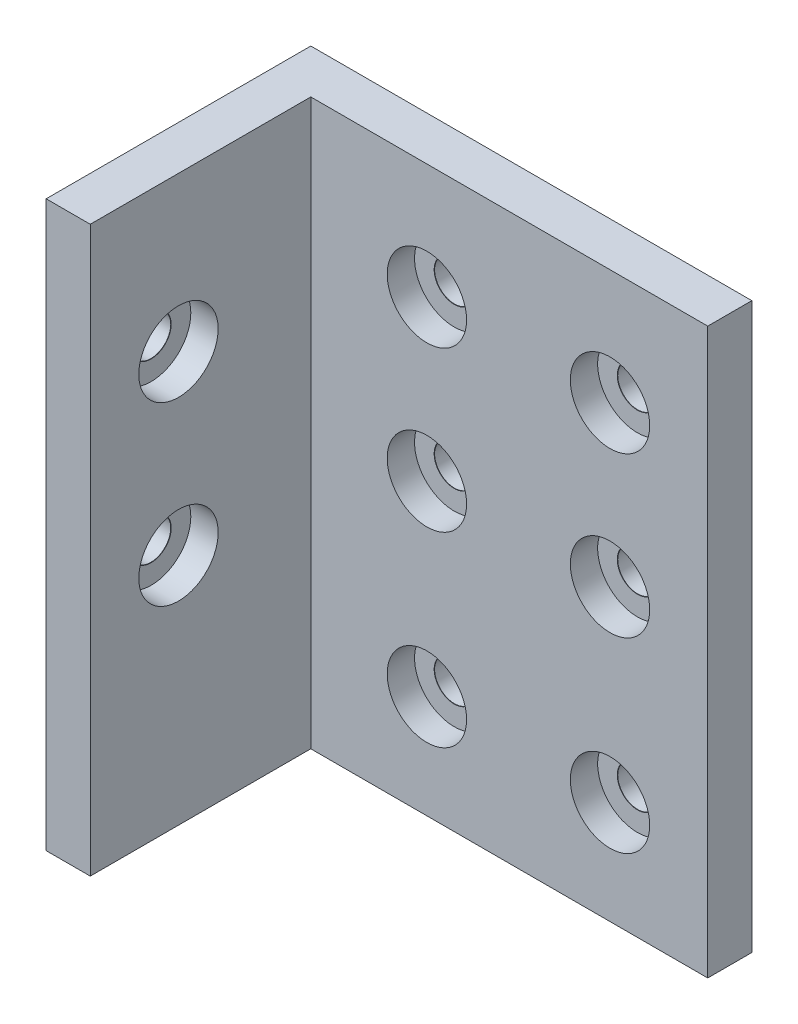
ISO-10303-21;
HEADER;
FILE_DESCRIPTION(('STEP AP214'),'2;1');
FILE_NAME('part.step','',(''),(''),'','','');
FILE_SCHEMA(('AUTOMOTIVE_DESIGN { 1 0 10303 214 1 1 1 1 }'));
ENDSEC;
DATA;
#1=APPLICATION_CONTEXT('core data for automotive mechanical design processes');
#2=APPLICATION_PROTOCOL_DEFINITION('international standard','automotive_design',2000,#1);
#3=PRODUCT_CONTEXT('',#1,'mechanical');
#4=PRODUCT('Part','Part','',(#3));
#5=PRODUCT_RELATED_PRODUCT_CATEGORY('part','',(#4));
#6=PRODUCT_DEFINITION_FORMATION('','',#4);
#7=PRODUCT_DEFINITION_CONTEXT('part definition',#1,'design');
#8=PRODUCT_DEFINITION('design','',#6,#7);
#9=PRODUCT_DEFINITION_SHAPE('','',#8);
#10=(LENGTH_UNIT() NAMED_UNIT(*) SI_UNIT(.MILLI.,.METRE.));
#11=(NAMED_UNIT(*) PLANE_ANGLE_UNIT() SI_UNIT($,.RADIAN.));
#12=(NAMED_UNIT(*) SI_UNIT($,.STERADIAN.) SOLID_ANGLE_UNIT());
#13=UNCERTAINTY_MEASURE_WITH_UNIT(LENGTH_MEASURE(1.E-05),#10,'distance_accuracy_value','');
#14=(GEOMETRIC_REPRESENTATION_CONTEXT(3) GLOBAL_UNCERTAINTY_ASSIGNED_CONTEXT((#13)) GLOBAL_UNIT_ASSIGNED_CONTEXT((#10,
#11,#12)) REPRESENTATION_CONTEXT('',''));
#15=CARTESIAN_POINT('',(0.,0.,0.));
#16=DIRECTION('',(0.,0.,1.));
#17=DIRECTION('',(1.,0.,0.));
#18=AXIS2_PLACEMENT_3D('',#15,#16,#17);
#19=CARTESIAN_POINT('',(-25.,-32.,30.));
#20=DIRECTION('',(1.,0.,0.));
#21=DIRECTION('',(0.,0.,-1.));
#22=AXIS2_PLACEMENT_3D('',#19,#20,#21);
#23=PLANE('',#22);
#24=CARTESIAN_POINT('',(-25.,-5.49999999999996,20.));
#25=DIRECTION('',(-1.,0.,0.));
#26=DIRECTION('',(0.,0.,1.));
#27=AXIS2_PLACEMENT_3D('',#24,#25,#26);
#28=CIRCLE('',#27,2.24999999999999);
#29=CARTESIAN_POINT('',(-25.,-5.49999999999996,22.25));
#30=VERTEX_POINT('',#29);
#31=EDGE_CURVE('E155',#30,#30,#28,.T.);
#32=ORIENTED_EDGE('',*,*,#31,.F.);
#33=EDGE_LOOP('',(#32));
#34=FACE_BOUND('',#33,.T.);
#35=DIRECTION('',(0.,-1.,0.));
#36=VECTOR('',#35,1.);
#37=CARTESIAN_POINT('',(-25.,-32.,0.));
#38=LINE('',#37,#36);
#39=CARTESIAN_POINT('',(-25.,32.,0.));
#40=VERTEX_POINT('',#39);
#41=CARTESIAN_POINT('',(-25.,-32.,0.));
#42=VERTEX_POINT('',#41);
#43=EDGE_CURVE('E97',#40,#42,#38,.T.);
#44=ORIENTED_EDGE('',*,*,#43,.T.);
#45=DIRECTION('',(0.,0.,-1.));
#46=VECTOR('',#45,1.);
#47=CARTESIAN_POINT('',(-25.,-32.,30.));
#48=LINE('',#47,#46);
#49=CARTESIAN_POINT('',(-25.,-32.,30.));
#50=VERTEX_POINT('',#49);
#51=EDGE_CURVE('E86',#50,#42,#48,.T.);
#52=ORIENTED_EDGE('',*,*,#51,.F.);
#53=DIRECTION('',(0.,-1.,0.));
#54=VECTOR('',#53,1.);
#55=CARTESIAN_POINT('',(-25.,-32.,30.));
#56=LINE('',#55,#54);
#57=CARTESIAN_POINT('',(-25.,32.,30.));
#58=VERTEX_POINT('',#57);
#59=EDGE_CURVE('E57',#58,#50,#56,.T.);
#60=ORIENTED_EDGE('',*,*,#59,.F.);
#61=DIRECTION('',(0.,0.,-1.));
#62=VECTOR('',#61,1.);
#63=CARTESIAN_POINT('',(-25.,32.,30.));
#64=LINE('',#63,#62);
#65=EDGE_CURVE('E111',#58,#40,#64,.T.);
#66=ORIENTED_EDGE('',*,*,#65,.T.);
#67=EDGE_LOOP('',(#44,#52,#60,#66));
#68=FACE_BOUND('',#67,.T.);
#69=CARTESIAN_POINT('',(-25.,14.5,20.));
#70=DIRECTION('',(-1.,0.,0.));
#71=DIRECTION('',(0.,0.,1.));
#72=AXIS2_PLACEMENT_3D('',#69,#70,#71);
#73=CIRCLE('',#72,2.24999999999999);
#74=CARTESIAN_POINT('',(-25.,14.5,22.25));
#75=VERTEX_POINT('',#74);
#76=EDGE_CURVE('E153',#75,#75,#73,.T.);
#77=ORIENTED_EDGE('',*,*,#76,.F.);
#78=EDGE_LOOP('',(#77));
#79=FACE_BOUND('',#78,.T.);
#80=ADVANCED_FACE('F34',(#34,#68,#79),#23,.F.);
#81=CARTESIAN_POINT('',(25.,-32.,30.));
#82=DIRECTION('',(-1.,0.,0.));
#83=DIRECTION('',(0.,0.,1.));
#84=AXIS2_PLACEMENT_3D('',#81,#82,#83);
#85=PLANE('',#84);
#86=DIRECTION('',(0.,0.,-1.));
#87=VECTOR('',#86,1.);
#88=CARTESIAN_POINT('',(25.,32.,30.));
#89=LINE('',#88,#87);
#90=CARTESIAN_POINT('',(25.,32.,5.));
#91=VERTEX_POINT('',#90);
#92=CARTESIAN_POINT('',(25.,32.,0.));
#93=VERTEX_POINT('',#92);
#94=EDGE_CURVE('E42',#91,#93,#89,.T.);
#95=ORIENTED_EDGE('',*,*,#94,.F.);
#96=DIRECTION('',(0.,-1.,0.));
#97=VECTOR('',#96,1.);
#98=CARTESIAN_POINT('',(25.,-32.,5.));
#99=LINE('',#98,#97);
#100=CARTESIAN_POINT('',(25.,-32.,5.));
#101=VERTEX_POINT('',#100);
#102=EDGE_CURVE('E83',#91,#101,#99,.T.);
#103=ORIENTED_EDGE('',*,*,#102,.T.);
#104=DIRECTION('',(0.,0.,-1.));
#105=VECTOR('',#104,1.);
#106=CARTESIAN_POINT('',(25.,-32.,30.));
#107=LINE('',#106,#105);
#108=CARTESIAN_POINT('',(25.,-32.,0.));
#109=VERTEX_POINT('',#108);
#110=EDGE_CURVE('E77',#101,#109,#107,.T.);
#111=ORIENTED_EDGE('',*,*,#110,.T.);
#112=DIRECTION('',(0.,1.,0.));
#113=VECTOR('',#112,1.);
#114=CARTESIAN_POINT('',(25.,-32.,0.));
#115=LINE('',#114,#113);
#116=EDGE_CURVE('E81',#109,#93,#115,.T.);
#117=ORIENTED_EDGE('',*,*,#116,.T.);
#118=EDGE_LOOP('',(#95,#103,#111,#117));
#119=FACE_BOUND('',#118,.T.);
#120=ADVANCED_FACE('F36',(#119),#85,.F.);
#121=CARTESIAN_POINT('',(-25.,32.,30.));
#122=DIRECTION('',(0.,-1.,0.));
#123=DIRECTION('',(0.,0.,-1.));
#124=AXIS2_PLACEMENT_3D('',#121,#122,#123);
#125=PLANE('',#124);
#126=DIRECTION('',(-1.,0.,0.));
#127=VECTOR('',#126,1.);
#128=CARTESIAN_POINT('',(-25.,32.,30.));
#129=LINE('',#128,#127);
#130=CARTESIAN_POINT('',(-20.,32.,30.));
#131=VERTEX_POINT('',#130);
#132=EDGE_CURVE('E96',#131,#58,#129,.T.);
#133=ORIENTED_EDGE('',*,*,#132,.F.);
#134=DIRECTION('',(0.,0.,1.));
#135=VECTOR('',#134,1.);
#136=CARTESIAN_POINT('',(-20.,32.,5.));
#137=LINE('',#136,#135);
#138=CARTESIAN_POINT('',(-20.,32.,5.));
#139=VERTEX_POINT('',#138);
#140=EDGE_CURVE('E49',#139,#131,#137,.T.);
#141=ORIENTED_EDGE('',*,*,#140,.F.);
#142=DIRECTION('',(-1.,0.,0.));
#143=VECTOR('',#142,1.);
#144=CARTESIAN_POINT('',(38.4438071011317,32.,5.));
#145=LINE('',#144,#143);
#146=EDGE_CURVE('E120',#91,#139,#145,.T.);
#147=ORIENTED_EDGE('',*,*,#146,.F.);
#148=ORIENTED_EDGE('',*,*,#94,.T.);
#149=DIRECTION('',(-1.,0.,0.));
#150=VECTOR('',#149,1.);
#151=CARTESIAN_POINT('',(-25.,32.,0.));
#152=LINE('',#151,#150);
#153=EDGE_CURVE('E101',#93,#40,#152,.T.);
#154=ORIENTED_EDGE('',*,*,#153,.T.);
#155=ORIENTED_EDGE('',*,*,#65,.F.);
#156=EDGE_LOOP('',(#133,#141,#147,#148,#154,#155));
#157=FACE_BOUND('',#156,.T.);
#158=ADVANCED_FACE('F116',(#157),#125,.F.);
#159=CARTESIAN_POINT('',(-25.,-32.,30.));
#160=DIRECTION('',(0.,1.,0.));
#161=DIRECTION('',(0.,0.,1.));
#162=AXIS2_PLACEMENT_3D('',#159,#160,#161);
#163=PLANE('',#162);
#164=DIRECTION('',(-1.,0.,0.));
#165=VECTOR('',#164,1.);
#166=CARTESIAN_POINT('',(38.4438071011317,-32.,5.));
#167=LINE('',#166,#165);
#168=CARTESIAN_POINT('',(-20.,-32.,5.));
#169=VERTEX_POINT('',#168);
#170=EDGE_CURVE('E131',#101,#169,#167,.T.);
#171=ORIENTED_EDGE('',*,*,#170,.T.);
#172=DIRECTION('',(0.,0.,1.));
#173=VECTOR('',#172,1.);
#174=CARTESIAN_POINT('',(-20.,-32.,5.));
#175=LINE('',#174,#173);
#176=CARTESIAN_POINT('',(-20.,-32.,30.));
#177=VERTEX_POINT('',#176);
#178=EDGE_CURVE('E135',#169,#177,#175,.T.);
#179=ORIENTED_EDGE('',*,*,#178,.T.);
#180=DIRECTION('',(1.,0.,0.));
#181=VECTOR('',#180,1.);
#182=CARTESIAN_POINT('',(-25.,-32.,30.));
#183=LINE('',#182,#181);
#184=EDGE_CURVE('E87',#50,#177,#183,.T.);
#185=ORIENTED_EDGE('',*,*,#184,.F.);
#186=ORIENTED_EDGE('',*,*,#51,.T.);
#187=DIRECTION('',(1.,0.,0.));
#188=VECTOR('',#187,1.);
#189=CARTESIAN_POINT('',(-25.,-32.,0.));
#190=LINE('',#189,#188);
#191=EDGE_CURVE('E91',#42,#109,#190,.T.);
#192=ORIENTED_EDGE('',*,*,#191,.T.);
#193=ORIENTED_EDGE('',*,*,#110,.F.);
#194=EDGE_LOOP('',(#171,#179,#185,#186,#192,#193));
#195=FACE_BOUND('',#194,.T.);
#196=ADVANCED_FACE('F92',(#195),#163,.F.);
#197=CARTESIAN_POINT('',(0.,0.,30.));
#198=DIRECTION('',(0.,0.,-1.));
#199=DIRECTION('',(-1.,0.,0.));
#200=AXIS2_PLACEMENT_3D('',#197,#198,#199);
#201=PLANE('',#200);
#202=ORIENTED_EDGE('',*,*,#184,.T.);
#203=DIRECTION('',(0.,1.,0.));
#204=VECTOR('',#203,1.);
#205=CARTESIAN_POINT('',(-20.,0.,30.));
#206=LINE('',#205,#204);
#207=EDGE_CURVE('E11',#177,#131,#206,.T.);
#208=ORIENTED_EDGE('',*,*,#207,.T.);
#209=ORIENTED_EDGE('',*,*,#132,.T.);
#210=ORIENTED_EDGE('',*,*,#59,.T.);
#211=EDGE_LOOP('',(#202,#208,#209,#210));
#212=FACE_BOUND('',#211,.T.);
#213=ADVANCED_FACE('F144',(#212),#201,.F.);
#214=CARTESIAN_POINT('',(0.,0.,0.));
#215=DIRECTION('',(0.,0.,-1.));
#216=DIRECTION('',(-1.,0.,0.));
#217=AXIS2_PLACEMENT_3D('',#214,#215,#216);
#218=PLANE('',#217);
#219=CARTESIAN_POINT('',(-6.8387302293402,18.9371519782642,0.));
#220=DIRECTION('',(0.,0.,-1.));
#221=DIRECTION('',(-1.,0.,0.));
#222=AXIS2_PLACEMENT_3D('',#219,#220,#221);
#223=CIRCLE('',#222,2.24999999999999);
#224=CARTESIAN_POINT('',(-9.08873022934019,18.9371519782642,0.));
#225=VERTEX_POINT('',#224);
#226=EDGE_CURVE('E159',#225,#225,#223,.T.);
#227=ORIENTED_EDGE('',*,*,#226,.F.);
#228=EDGE_LOOP('',(#227));
#229=FACE_BOUND('',#228,.T.);
#230=CARTESIAN_POINT('',(13.9202853801938,18.9371519782497,0.));
#231=DIRECTION('',(0.,0.,-1.));
#232=DIRECTION('',(-1.,0.,0.));
#233=AXIS2_PLACEMENT_3D('',#230,#231,#232);
#234=CIRCLE('',#233,2.24999999999999);
#235=CARTESIAN_POINT('',(11.6702853801938,18.9371519782497,0.));
#236=VERTEX_POINT('',#235);
#237=EDGE_CURVE('E168',#236,#236,#234,.T.);
#238=ORIENTED_EDGE('',*,*,#237,.F.);
#239=EDGE_LOOP('',(#238));
#240=FACE_BOUND('',#239,.T.);
#241=CARTESIAN_POINT('',(13.9202853801811,0.863082180349736,0.));
#242=DIRECTION('',(0.,0.,-1.));
#243=DIRECTION('',(-1.,0.,0.));
#244=AXIS2_PLACEMENT_3D('',#241,#242,#243);
#245=CIRCLE('',#244,2.24999999999999);
#246=CARTESIAN_POINT('',(11.6702853801811,0.863082180349736,0.));
#247=VERTEX_POINT('',#246);
#248=EDGE_CURVE('E171',#247,#247,#245,.T.);
#249=ORIENTED_EDGE('',*,*,#248,.F.);
#250=EDGE_LOOP('',(#249));
#251=FACE_BOUND('',#250,.T.);
#252=CARTESIAN_POINT('',(-6.83873022935286,0.86308218036428,0.));
#253=DIRECTION('',(0.,0.,-1.));
#254=DIRECTION('',(-1.,0.,0.));
#255=AXIS2_PLACEMENT_3D('',#252,#253,#254);
#256=CIRCLE('',#255,2.24999999999999);
#257=CARTESIAN_POINT('',(-9.08873022935285,0.86308218036428,0.));
#258=VERTEX_POINT('',#257);
#259=EDGE_CURVE('E174',#258,#258,#256,.T.);
#260=ORIENTED_EDGE('',*,*,#259,.F.);
#261=EDGE_LOOP('',(#260));
#262=FACE_BOUND('',#261,.T.);
#263=CARTESIAN_POINT('',(-6.83873022936765,-20.3015137360552,0.));
#264=DIRECTION('',(0.,0.,-1.));
#265=DIRECTION('',(-1.,0.,0.));
#266=AXIS2_PLACEMENT_3D('',#263,#264,#265);
#267=CIRCLE('',#266,2.24999999999999);
#268=CARTESIAN_POINT('',(-9.08873022936764,-20.3015137360552,0.));
#269=VERTEX_POINT('',#268);
#270=EDGE_CURVE('E177',#269,#269,#267,.T.);
#271=ORIENTED_EDGE('',*,*,#270,.F.);
#272=EDGE_LOOP('',(#271));
#273=FACE_BOUND('',#272,.T.);
#274=CARTESIAN_POINT('',(13.9202853801663,-20.3015137360697,0.));
#275=DIRECTION('',(0.,0.,-1.));
#276=DIRECTION('',(-1.,0.,0.));
#277=AXIS2_PLACEMENT_3D('',#274,#275,#276);
#278=CIRCLE('',#277,2.24999999999999);
#279=CARTESIAN_POINT('',(11.6702853801663,-20.3015137360697,0.));
#280=VERTEX_POINT('',#279);
#281=EDGE_CURVE('E142',#280,#280,#278,.T.);
#282=ORIENTED_EDGE('',*,*,#281,.F.);
#283=EDGE_LOOP('',(#282));
#284=FACE_BOUND('',#283,.T.);
#285=ORIENTED_EDGE('',*,*,#116,.F.);
#286=ORIENTED_EDGE('',*,*,#191,.F.);
#287=ORIENTED_EDGE('',*,*,#43,.F.);
#288=ORIENTED_EDGE('',*,*,#153,.F.);
#289=EDGE_LOOP('',(#285,#286,#287,#288));
#290=FACE_BOUND('',#289,.T.);
#291=ADVANCED_FACE('F100',(#229,#240,#251,#262,#273,#284,#290),#218,.T.);
#292=CARTESIAN_POINT('',(38.4438071011317,-32.,5.));
#293=DIRECTION('',(0.,0.,-1.));
#294=DIRECTION('',(-1.,0.,0.));
#295=AXIS2_PLACEMENT_3D('',#292,#293,#294);
#296=PLANE('',#295);
#297=CARTESIAN_POINT('',(13.9202853801938,18.9371519782497,5.));
#298=DIRECTION('',(0.,0.,1.));
#299=DIRECTION('',(1.,0.,0.));
#300=AXIS2_PLACEMENT_3D('',#297,#298,#299);
#301=CIRCLE('',#300,4.49999999999999);
#302=CARTESIAN_POINT('',(18.4202853801938,18.9371519782497,5.));
#303=VERTEX_POINT('',#302);
#304=EDGE_CURVE('E577',#303,#303,#301,.T.);
#305=ORIENTED_EDGE('',*,*,#304,.F.);
#306=EDGE_LOOP('',(#305));
#307=FACE_BOUND('',#306,.T.);
#308=CARTESIAN_POINT('',(-6.8387302293402,18.9371519782642,5.));
#309=DIRECTION('',(0.,0.,1.));
#310=DIRECTION('',(1.,0.,0.));
#311=AXIS2_PLACEMENT_3D('',#308,#309,#310);
#312=CIRCLE('',#311,4.49999999999999);
#313=CARTESIAN_POINT('',(-2.33873022934021,18.9371519782642,5.));
#314=VERTEX_POINT('',#313);
#315=EDGE_CURVE('E589',#314,#314,#312,.T.);
#316=ORIENTED_EDGE('',*,*,#315,.F.);
#317=EDGE_LOOP('',(#316));
#318=FACE_BOUND('',#317,.T.);
#319=CARTESIAN_POINT('',(13.9202853801811,0.863082180349736,5.));
#320=DIRECTION('',(0.,0.,1.));
#321=DIRECTION('',(1.,0.,0.));
#322=AXIS2_PLACEMENT_3D('',#319,#320,#321);
#323=CIRCLE('',#322,4.49999999999999);
#324=CARTESIAN_POINT('',(18.4202853801811,0.863082180349736,5.));
#325=VERTEX_POINT('',#324);
#326=EDGE_CURVE('E601',#325,#325,#323,.T.);
#327=ORIENTED_EDGE('',*,*,#326,.F.);
#328=EDGE_LOOP('',(#327));
#329=FACE_BOUND('',#328,.T.);
#330=CARTESIAN_POINT('',(-6.83873022935286,0.86308218036428,5.));
#331=DIRECTION('',(0.,0.,1.));
#332=DIRECTION('',(1.,0.,0.));
#333=AXIS2_PLACEMENT_3D('',#330,#331,#332);
#334=CIRCLE('',#333,4.49999999999999);
#335=CARTESIAN_POINT('',(-2.33873022935286,0.86308218036428,5.));
#336=VERTEX_POINT('',#335);
#337=EDGE_CURVE('E613',#336,#336,#334,.T.);
#338=ORIENTED_EDGE('',*,*,#337,.F.);
#339=EDGE_LOOP('',(#338));
#340=FACE_BOUND('',#339,.T.);
#341=CARTESIAN_POINT('',(13.9202853801663,-20.3015137360697,5.));
#342=DIRECTION('',(0.,0.,1.));
#343=DIRECTION('',(1.,0.,0.));
#344=AXIS2_PLACEMENT_3D('',#341,#342,#343);
#345=CIRCLE('',#344,4.49999999999999);
#346=CARTESIAN_POINT('',(18.4202853801663,-20.3015137360697,5.));
#347=VERTEX_POINT('',#346);
#348=EDGE_CURVE('E625',#347,#347,#345,.T.);
#349=ORIENTED_EDGE('',*,*,#348,.F.);
#350=EDGE_LOOP('',(#349));
#351=FACE_BOUND('',#350,.T.);
#352=CARTESIAN_POINT('',(-6.83873022936765,-20.3015137360552,5.));
#353=DIRECTION('',(0.,0.,1.));
#354=DIRECTION('',(1.,0.,0.));
#355=AXIS2_PLACEMENT_3D('',#352,#353,#354);
#356=CIRCLE('',#355,4.49999999999999);
#357=CARTESIAN_POINT('',(-2.33873022936766,-20.3015137360552,5.));
#358=VERTEX_POINT('',#357);
#359=EDGE_CURVE('E637',#358,#358,#356,.T.);
#360=ORIENTED_EDGE('',*,*,#359,.F.);
#361=EDGE_LOOP('',(#360));
#362=FACE_BOUND('',#361,.T.);
#363=ORIENTED_EDGE('',*,*,#146,.T.);
#364=DIRECTION('',(0.,1.,0.));
#365=VECTOR('',#364,1.);
#366=CARTESIAN_POINT('',(-20.,-32.,5.));
#367=LINE('',#366,#365);
#368=EDGE_CURVE('E104',#169,#139,#367,.T.);
#369=ORIENTED_EDGE('',*,*,#368,.F.);
#370=ORIENTED_EDGE('',*,*,#170,.F.);
#371=ORIENTED_EDGE('',*,*,#102,.F.);
#372=EDGE_LOOP('',(#363,#369,#370,#371));
#373=FACE_BOUND('',#372,.T.);
#374=ADVANCED_FACE('F132',(#307,#318,#329,#340,#351,#362,#373),#296,.F.);
#375=CARTESIAN_POINT('',(-20.,-32.,5.));
#376=DIRECTION('',(-1.,0.,0.));
#377=DIRECTION('',(0.,0.,1.));
#378=AXIS2_PLACEMENT_3D('',#375,#376,#377);
#379=PLANE('',#378);
#380=CARTESIAN_POINT('',(-20.,14.5,20.));
#381=DIRECTION('',(1.,0.,0.));
#382=DIRECTION('',(0.,0.,-1.));
#383=AXIS2_PLACEMENT_3D('',#380,#381,#382);
#384=CIRCLE('',#383,4.5);
#385=CARTESIAN_POINT('',(-20.,14.5,15.5));
#386=VERTEX_POINT('',#385);
#387=EDGE_CURVE('E555',#386,#386,#384,.T.);
#388=ORIENTED_EDGE('',*,*,#387,.F.);
#389=EDGE_LOOP('',(#388));
#390=FACE_BOUND('',#389,.T.);
#391=CARTESIAN_POINT('',(-20.,-5.49999999999996,20.));
#392=DIRECTION('',(1.,0.,0.));
#393=DIRECTION('',(0.,0.,-1.));
#394=AXIS2_PLACEMENT_3D('',#391,#392,#393);
#395=CIRCLE('',#394,4.49999999999999);
#396=CARTESIAN_POINT('',(-20.,-5.49999999999996,15.5));
#397=VERTEX_POINT('',#396);
#398=EDGE_CURVE('E565',#397,#397,#395,.T.);
#399=ORIENTED_EDGE('',*,*,#398,.F.);
#400=EDGE_LOOP('',(#399));
#401=FACE_BOUND('',#400,.T.);
#402=ORIENTED_EDGE('',*,*,#178,.F.);
#403=ORIENTED_EDGE('',*,*,#368,.T.);
#404=ORIENTED_EDGE('',*,*,#140,.T.);
#405=ORIENTED_EDGE('',*,*,#207,.F.);
#406=EDGE_LOOP('',(#402,#403,#404,#405));
#407=FACE_BOUND('',#406,.T.);
#408=ADVANCED_FACE('F145',(#390,#401,#407),#379,.F.);
#409=CARTESIAN_POINT('',(13.9202853801663,-20.3015137360697,0.));
#410=DIRECTION('',(0.,0.,-1.));
#411=DIRECTION('',(-1.,0.,0.));
#412=AXIS2_PLACEMENT_3D('',#409,#410,#411);
#413=CYLINDRICAL_SURFACE('',#412,2.24999999999999);
#414=CARTESIAN_POINT('',(13.9202853801663,-20.3015137360697,1.875));
#415=DIRECTION('',(0.,0.,1.));
#416=DIRECTION('',(1.,0.,0.));
#417=AXIS2_PLACEMENT_3D('',#414,#415,#416);
#418=CIRCLE('',#417,2.25);
#419=CARTESIAN_POINT('',(16.1702853801663,-20.3015137360697,1.875));
#420=VERTEX_POINT('',#419);
#421=EDGE_CURVE('E634',#420,#420,#418,.T.);
#422=ORIENTED_EDGE('',*,*,#421,.T.);
#423=EDGE_LOOP('',(#422));
#424=FACE_BOUND('',#423,.T.);
#425=ORIENTED_EDGE('',*,*,#281,.T.);
#426=EDGE_LOOP('',(#425));
#427=FACE_BOUND('',#426,.T.);
#428=ADVANCED_FACE('F182',(#424,#427),#413,.F.);
#429=CARTESIAN_POINT('',(-6.83873022936765,-20.3015137360552,0.));
#430=DIRECTION('',(0.,0.,-1.));
#431=DIRECTION('',(-1.,0.,0.));
#432=AXIS2_PLACEMENT_3D('',#429,#430,#431);
#433=CYLINDRICAL_SURFACE('',#432,2.24999999999999);
#434=CARTESIAN_POINT('',(-6.83873022936765,-20.3015137360552,1.875));
#435=DIRECTION('',(0.,0.,1.));
#436=DIRECTION('',(1.,0.,0.));
#437=AXIS2_PLACEMENT_3D('',#434,#435,#436);
#438=CIRCLE('',#437,2.25);
#439=CARTESIAN_POINT('',(-4.58873022936765,-20.3015137360552,1.875));
#440=VERTEX_POINT('',#439);
#441=EDGE_CURVE('E156',#440,#440,#438,.T.);
#442=ORIENTED_EDGE('',*,*,#441,.T.);
#443=EDGE_LOOP('',(#442));
#444=FACE_BOUND('',#443,.T.);
#445=ORIENTED_EDGE('',*,*,#270,.T.);
#446=EDGE_LOOP('',(#445));
#447=FACE_BOUND('',#446,.T.);
#448=ADVANCED_FACE('F231',(#444,#447),#433,.F.);
#449=CARTESIAN_POINT('',(-6.83873022935286,0.86308218036428,0.));
#450=DIRECTION('',(0.,0.,-1.));
#451=DIRECTION('',(-1.,0.,0.));
#452=AXIS2_PLACEMENT_3D('',#449,#450,#451);
#453=CYLINDRICAL_SURFACE('',#452,2.24999999999999);
#454=CARTESIAN_POINT('',(-6.83873022935286,0.86308218036428,1.875));
#455=DIRECTION('',(0.,0.,1.));
#456=DIRECTION('',(1.,0.,0.));
#457=AXIS2_PLACEMENT_3D('',#454,#455,#456);
#458=CIRCLE('',#457,2.25);
#459=CARTESIAN_POINT('',(-4.58873022935286,0.86308218036428,1.875));
#460=VERTEX_POINT('',#459);
#461=EDGE_CURVE('E622',#460,#460,#458,.T.);
#462=ORIENTED_EDGE('',*,*,#461,.T.);
#463=EDGE_LOOP('',(#462));
#464=FACE_BOUND('',#463,.T.);
#465=ORIENTED_EDGE('',*,*,#259,.T.);
#466=EDGE_LOOP('',(#465));
#467=FACE_BOUND('',#466,.T.);
#468=ADVANCED_FACE('F241',(#464,#467),#453,.F.);
#469=CARTESIAN_POINT('',(13.9202853801811,0.863082180349736,0.));
#470=DIRECTION('',(0.,0.,-1.));
#471=DIRECTION('',(-1.,0.,0.));
#472=AXIS2_PLACEMENT_3D('',#469,#470,#471);
#473=CYLINDRICAL_SURFACE('',#472,2.24999999999999);
#474=CARTESIAN_POINT('',(13.9202853801811,0.863082180349736,1.875));
#475=DIRECTION('',(0.,0.,1.));
#476=DIRECTION('',(1.,0.,0.));
#477=AXIS2_PLACEMENT_3D('',#474,#475,#476);
#478=CIRCLE('',#477,2.25);
#479=CARTESIAN_POINT('',(16.1702853801811,0.863082180349736,1.875));
#480=VERTEX_POINT('',#479);
#481=EDGE_CURVE('E610',#480,#480,#478,.T.);
#482=ORIENTED_EDGE('',*,*,#481,.T.);
#483=EDGE_LOOP('',(#482));
#484=FACE_BOUND('',#483,.T.);
#485=ORIENTED_EDGE('',*,*,#248,.T.);
#486=EDGE_LOOP('',(#485));
#487=FACE_BOUND('',#486,.T.);
#488=ADVANCED_FACE('F251',(#484,#487),#473,.F.);
#489=CARTESIAN_POINT('',(13.9202853801938,18.9371519782497,0.));
#490=DIRECTION('',(0.,0.,-1.));
#491=DIRECTION('',(-1.,0.,0.));
#492=AXIS2_PLACEMENT_3D('',#489,#490,#491);
#493=CYLINDRICAL_SURFACE('',#492,2.24999999999999);
#494=CARTESIAN_POINT('',(13.9202853801938,18.9371519782497,1.875));
#495=DIRECTION('',(0.,0.,1.));
#496=DIRECTION('',(1.,0.,0.));
#497=AXIS2_PLACEMENT_3D('',#494,#495,#496);
#498=CIRCLE('',#497,2.25);
#499=CARTESIAN_POINT('',(16.1702853801938,18.9371519782497,1.875));
#500=VERTEX_POINT('',#499);
#501=EDGE_CURVE('E586',#500,#500,#498,.T.);
#502=ORIENTED_EDGE('',*,*,#501,.T.);
#503=EDGE_LOOP('',(#502));
#504=FACE_BOUND('',#503,.T.);
#505=ORIENTED_EDGE('',*,*,#237,.T.);
#506=EDGE_LOOP('',(#505));
#507=FACE_BOUND('',#506,.T.);
#508=ADVANCED_FACE('F261',(#504,#507),#493,.F.);
#509=CARTESIAN_POINT('',(-6.8387302293402,18.9371519782642,0.));
#510=DIRECTION('',(0.,0.,-1.));
#511=DIRECTION('',(-1.,0.,0.));
#512=AXIS2_PLACEMENT_3D('',#509,#510,#511);
#513=CYLINDRICAL_SURFACE('',#512,2.24999999999999);
#514=CARTESIAN_POINT('',(-6.8387302293402,18.9371519782642,1.875));
#515=DIRECTION('',(0.,0.,1.));
#516=DIRECTION('',(1.,0.,0.));
#517=AXIS2_PLACEMENT_3D('',#514,#515,#516);
#518=CIRCLE('',#517,2.25);
#519=CARTESIAN_POINT('',(-4.5887302293402,18.9371519782642,1.875));
#520=VERTEX_POINT('',#519);
#521=EDGE_CURVE('E598',#520,#520,#518,.T.);
#522=ORIENTED_EDGE('',*,*,#521,.T.);
#523=EDGE_LOOP('',(#522));
#524=FACE_BOUND('',#523,.T.);
#525=ORIENTED_EDGE('',*,*,#226,.T.);
#526=EDGE_LOOP('',(#525));
#527=FACE_BOUND('',#526,.T.);
#528=ADVANCED_FACE('F271',(#524,#527),#513,.F.);
#529=CARTESIAN_POINT('',(-25.,-5.49999999999996,20.));
#530=DIRECTION('',(-1.,0.,0.));
#531=DIRECTION('',(0.,0.,1.));
#532=AXIS2_PLACEMENT_3D('',#529,#530,#531);
#533=CYLINDRICAL_SURFACE('',#532,2.24999999999999);
#534=CARTESIAN_POINT('',(-23.125,-5.49999999999996,20.));
#535=DIRECTION('',(1.,0.,0.));
#536=DIRECTION('',(0.,0.,-1.));
#537=AXIS2_PLACEMENT_3D('',#534,#535,#536);
#538=CIRCLE('',#537,2.25);
#539=CARTESIAN_POINT('',(-23.125,-5.49999999999996,17.75));
#540=VERTEX_POINT('',#539);
#541=EDGE_CURVE('E574',#540,#540,#538,.T.);
#542=ORIENTED_EDGE('',*,*,#541,.T.);
#543=EDGE_LOOP('',(#542));
#544=FACE_BOUND('',#543,.T.);
#545=ORIENTED_EDGE('',*,*,#31,.T.);
#546=EDGE_LOOP('',(#545));
#547=FACE_BOUND('',#546,.T.);
#548=ADVANCED_FACE('F280',(#544,#547),#533,.F.);
#549=CARTESIAN_POINT('',(-25.,14.5,20.));
#550=DIRECTION('',(-1.,0.,0.));
#551=DIRECTION('',(0.,0.,1.));
#552=AXIS2_PLACEMENT_3D('',#549,#550,#551);
#553=CYLINDRICAL_SURFACE('',#552,2.24999999999999);
#554=CARTESIAN_POINT('',(-23.125,14.5,20.));
#555=DIRECTION('',(1.,0.,0.));
#556=DIRECTION('',(0.,0.,-1.));
#557=AXIS2_PLACEMENT_3D('',#554,#555,#556);
#558=CIRCLE('',#557,2.25);
#559=CARTESIAN_POINT('',(-23.125,14.5,17.75));
#560=VERTEX_POINT('',#559);
#561=EDGE_CURVE('E562',#560,#560,#558,.T.);
#562=ORIENTED_EDGE('',*,*,#561,.T.);
#563=EDGE_LOOP('',(#562));
#564=FACE_BOUND('',#563,.T.);
#565=ORIENTED_EDGE('',*,*,#76,.T.);
#566=EDGE_LOOP('',(#565));
#567=FACE_BOUND('',#566,.T.);
#568=ADVANCED_FACE('F293',(#564,#567),#553,.F.);
#569=CARTESIAN_POINT('',(-6.83873022936765,-20.3015137360552,1.9));
#570=DIRECTION('',(0.,0.,1.));
#571=DIRECTION('',(1.,0.,0.));
#572=AXIS2_PLACEMENT_3D('',#569,#570,#571);
#573=CONICAL_SURFACE('',#572,2.275,0.785398163397483);
#574=ORIENTED_EDGE('',*,*,#441,.F.);
#575=EDGE_LOOP('',(#574));
#576=FACE_BOUND('',#575,.T.);
#577=CARTESIAN_POINT('',(-6.83873022936765,-20.3015137360552,1.9));
#578=DIRECTION('',(0.,0.,1.));
#579=DIRECTION('',(1.,0.,0.));
#580=AXIS2_PLACEMENT_3D('',#577,#578,#579);
#581=CIRCLE('',#580,2.275);
#582=CARTESIAN_POINT('',(-4.56373022936765,-20.3015137360552,1.9));
#583=VERTEX_POINT('',#582);
#584=EDGE_CURVE('E162',#583,#583,#581,.T.);
#585=ORIENTED_EDGE('',*,*,#584,.T.);
#586=EDGE_LOOP('',(#585));
#587=FACE_BOUND('',#586,.T.);
#588=ADVANCED_FACE('F287',(#576,#587),#573,.F.);
#589=CARTESIAN_POINT('',(-4.56373022936765,-20.3015137360552,1.9));
#590=DIRECTION('',(0.,0.,-1.));
#591=DIRECTION('',(-1.,0.,0.));
#592=AXIS2_PLACEMENT_3D('',#589,#590,#591);
#593=PLANE('',#592);
#594=ORIENTED_EDGE('',*,*,#584,.F.);
#595=EDGE_LOOP('',(#594));
#596=FACE_BOUND('',#595,.T.);
#597=CARTESIAN_POINT('',(-6.83873022936765,-20.3015137360552,1.9));
#598=DIRECTION('',(0.,0.,1.));
#599=DIRECTION('',(1.,0.,0.));
#600=AXIS2_PLACEMENT_3D('',#597,#598,#599);
#601=CIRCLE('',#600,4.49999999999999);
#602=CARTESIAN_POINT('',(-2.33873022936766,-20.3015137360552,1.9));
#603=VERTEX_POINT('',#602);
#604=EDGE_CURVE('E640',#603,#603,#601,.T.);
#605=ORIENTED_EDGE('',*,*,#604,.T.);
#606=EDGE_LOOP('',(#605));
#607=FACE_BOUND('',#606,.T.);
#608=ADVANCED_FACE('F292',(#596,#607),#593,.F.);
#609=CARTESIAN_POINT('',(-6.83873022936765,-20.3015137360552,5.));
#610=DIRECTION('',(0.,0.,1.));
#611=DIRECTION('',(1.,0.,0.));
#612=AXIS2_PLACEMENT_3D('',#609,#610,#611);
#613=CYLINDRICAL_SURFACE('',#612,4.49999999999999);
#614=ORIENTED_EDGE('',*,*,#604,.F.);
#615=EDGE_LOOP('',(#614));
#616=FACE_BOUND('',#615,.T.);
#617=ORIENTED_EDGE('',*,*,#359,.T.);
#618=EDGE_LOOP('',(#617));
#619=FACE_BOUND('',#618,.T.);
#620=ADVANCED_FACE('F305',(#616,#619),#613,.F.);
#621=CARTESIAN_POINT('',(13.9202853801663,-20.3015137360697,1.9));
#622=DIRECTION('',(0.,0.,1.));
#623=DIRECTION('',(1.,0.,0.));
#624=AXIS2_PLACEMENT_3D('',#621,#622,#623);
#625=CONICAL_SURFACE('',#624,2.275,0.785398163397448);
#626=ORIENTED_EDGE('',*,*,#421,.F.);
#627=EDGE_LOOP('',(#626));
#628=FACE_BOUND('',#627,.T.);
#629=CARTESIAN_POINT('',(13.9202853801663,-20.3015137360697,1.9));
#630=DIRECTION('',(0.,0.,1.));
#631=DIRECTION('',(1.,0.,0.));
#632=AXIS2_PLACEMENT_3D('',#629,#630,#631);
#633=CIRCLE('',#632,2.275);
#634=CARTESIAN_POINT('',(16.1952853801663,-20.3015137360697,1.9));
#635=VERTEX_POINT('',#634);
#636=EDGE_CURVE('E631',#635,#635,#633,.T.);
#637=ORIENTED_EDGE('',*,*,#636,.T.);
#638=EDGE_LOOP('',(#637));
#639=FACE_BOUND('',#638,.T.);
#640=ADVANCED_FACE('F315',(#628,#639),#625,.F.);
#641=CARTESIAN_POINT('',(16.1952853801663,-20.3015137360697,1.9));
#642=DIRECTION('',(0.,0.,-1.));
#643=DIRECTION('',(-1.,0.,0.));
#644=AXIS2_PLACEMENT_3D('',#641,#642,#643);
#645=PLANE('',#644);
#646=ORIENTED_EDGE('',*,*,#636,.F.);
#647=EDGE_LOOP('',(#646));
#648=FACE_BOUND('',#647,.T.);
#649=CARTESIAN_POINT('',(13.9202853801663,-20.3015137360697,1.9));
#650=DIRECTION('',(0.,0.,1.));
#651=DIRECTION('',(1.,0.,0.));
#652=AXIS2_PLACEMENT_3D('',#649,#650,#651);
#653=CIRCLE('',#652,4.49999999999999);
#654=CARTESIAN_POINT('',(18.4202853801663,-20.3015137360697,1.9));
#655=VERTEX_POINT('',#654);
#656=EDGE_CURVE('E628',#655,#655,#653,.T.);
#657=ORIENTED_EDGE('',*,*,#656,.T.);
#658=EDGE_LOOP('',(#657));
#659=FACE_BOUND('',#658,.T.);
#660=ADVANCED_FACE('F325',(#648,#659),#645,.F.);
#661=CARTESIAN_POINT('',(13.9202853801663,-20.3015137360697,5.));
#662=DIRECTION('',(0.,0.,1.));
#663=DIRECTION('',(1.,0.,0.));
#664=AXIS2_PLACEMENT_3D('',#661,#662,#663);
#665=CYLINDRICAL_SURFACE('',#664,4.49999999999999);
#666=ORIENTED_EDGE('',*,*,#656,.F.);
#667=EDGE_LOOP('',(#666));
#668=FACE_BOUND('',#667,.T.);
#669=ORIENTED_EDGE('',*,*,#348,.T.);
#670=EDGE_LOOP('',(#669));
#671=FACE_BOUND('',#670,.T.);
#672=ADVANCED_FACE('F335',(#668,#671),#665,.F.);
#673=CARTESIAN_POINT('',(-6.83873022935286,0.86308218036428,1.9));
#674=DIRECTION('',(0.,0.,1.));
#675=DIRECTION('',(1.,0.,0.));
#676=AXIS2_PLACEMENT_3D('',#673,#674,#675);
#677=CONICAL_SURFACE('',#676,2.275,0.785398163397483);
#678=ORIENTED_EDGE('',*,*,#461,.F.);
#679=EDGE_LOOP('',(#678));
#680=FACE_BOUND('',#679,.T.);
#681=CARTESIAN_POINT('',(-6.83873022935286,0.86308218036428,1.9));
#682=DIRECTION('',(0.,0.,1.));
#683=DIRECTION('',(1.,0.,0.));
#684=AXIS2_PLACEMENT_3D('',#681,#682,#683);
#685=CIRCLE('',#684,2.275);
#686=CARTESIAN_POINT('',(-4.56373022935286,0.86308218036428,1.9));
#687=VERTEX_POINT('',#686);
#688=EDGE_CURVE('E619',#687,#687,#685,.T.);
#689=ORIENTED_EDGE('',*,*,#688,.T.);
#690=EDGE_LOOP('',(#689));
#691=FACE_BOUND('',#690,.T.);
#692=ADVANCED_FACE('F345',(#680,#691),#677,.F.);
#693=CARTESIAN_POINT('',(-4.56373022935286,0.86308218036428,1.9));
#694=DIRECTION('',(0.,0.,-1.));
#695=DIRECTION('',(-1.,0.,0.));
#696=AXIS2_PLACEMENT_3D('',#693,#694,#695);
#697=PLANE('',#696);
#698=ORIENTED_EDGE('',*,*,#688,.F.);
#699=EDGE_LOOP('',(#698));
#700=FACE_BOUND('',#699,.T.);
#701=CARTESIAN_POINT('',(-6.83873022935286,0.86308218036428,1.9));
#702=DIRECTION('',(0.,0.,1.));
#703=DIRECTION('',(1.,0.,0.));
#704=AXIS2_PLACEMENT_3D('',#701,#702,#703);
#705=CIRCLE('',#704,4.49999999999999);
#706=CARTESIAN_POINT('',(-2.33873022935286,0.86308218036428,1.9));
#707=VERTEX_POINT('',#706);
#708=EDGE_CURVE('E616',#707,#707,#705,.T.);
#709=ORIENTED_EDGE('',*,*,#708,.T.);
#710=EDGE_LOOP('',(#709));
#711=FACE_BOUND('',#710,.T.);
#712=ADVANCED_FACE('F355',(#700,#711),#697,.F.);
#713=CARTESIAN_POINT('',(-6.83873022935286,0.86308218036428,5.));
#714=DIRECTION('',(0.,0.,1.));
#715=DIRECTION('',(1.,0.,0.));
#716=AXIS2_PLACEMENT_3D('',#713,#714,#715);
#717=CYLINDRICAL_SURFACE('',#716,4.49999999999999);
#718=ORIENTED_EDGE('',*,*,#708,.F.);
#719=EDGE_LOOP('',(#718));
#720=FACE_BOUND('',#719,.T.);
#721=ORIENTED_EDGE('',*,*,#337,.T.);
#722=EDGE_LOOP('',(#721));
#723=FACE_BOUND('',#722,.T.);
#724=ADVANCED_FACE('F365',(#720,#723),#717,.F.);
#725=CARTESIAN_POINT('',(13.9202853801811,0.863082180349736,1.9));
#726=DIRECTION('',(0.,0.,1.));
#727=DIRECTION('',(1.,0.,0.));
#728=AXIS2_PLACEMENT_3D('',#725,#726,#727);
#729=CONICAL_SURFACE('',#728,2.275,0.785398163397448);
#730=ORIENTED_EDGE('',*,*,#481,.F.);
#731=EDGE_LOOP('',(#730));
#732=FACE_BOUND('',#731,.T.);
#733=CARTESIAN_POINT('',(13.9202853801811,0.863082180349736,1.9));
#734=DIRECTION('',(0.,0.,1.));
#735=DIRECTION('',(1.,0.,0.));
#736=AXIS2_PLACEMENT_3D('',#733,#734,#735);
#737=CIRCLE('',#736,2.275);
#738=CARTESIAN_POINT('',(16.1952853801811,0.863082180349736,1.9));
#739=VERTEX_POINT('',#738);
#740=EDGE_CURVE('E607',#739,#739,#737,.T.);
#741=ORIENTED_EDGE('',*,*,#740,.T.);
#742=EDGE_LOOP('',(#741));
#743=FACE_BOUND('',#742,.T.);
#744=ADVANCED_FACE('F375',(#732,#743),#729,.F.);
#745=CARTESIAN_POINT('',(16.1952853801811,0.863082180349736,1.9));
#746=DIRECTION('',(0.,0.,-1.));
#747=DIRECTION('',(-1.,0.,0.));
#748=AXIS2_PLACEMENT_3D('',#745,#746,#747);
#749=PLANE('',#748);
#750=ORIENTED_EDGE('',*,*,#740,.F.);
#751=EDGE_LOOP('',(#750));
#752=FACE_BOUND('',#751,.T.);
#753=CARTESIAN_POINT('',(13.9202853801811,0.863082180349736,1.9));
#754=DIRECTION('',(0.,0.,1.));
#755=DIRECTION('',(1.,0.,0.));
#756=AXIS2_PLACEMENT_3D('',#753,#754,#755);
#757=CIRCLE('',#756,4.49999999999999);
#758=CARTESIAN_POINT('',(18.4202853801811,0.863082180349736,1.9));
#759=VERTEX_POINT('',#758);
#760=EDGE_CURVE('E604',#759,#759,#757,.T.);
#761=ORIENTED_EDGE('',*,*,#760,.T.);
#762=EDGE_LOOP('',(#761));
#763=FACE_BOUND('',#762,.T.);
#764=ADVANCED_FACE('F385',(#752,#763),#749,.F.);
#765=CARTESIAN_POINT('',(13.9202853801811,0.863082180349736,5.));
#766=DIRECTION('',(0.,0.,1.));
#767=DIRECTION('',(1.,0.,0.));
#768=AXIS2_PLACEMENT_3D('',#765,#766,#767);
#769=CYLINDRICAL_SURFACE('',#768,4.49999999999999);
#770=ORIENTED_EDGE('',*,*,#760,.F.);
#771=EDGE_LOOP('',(#770));
#772=FACE_BOUND('',#771,.T.);
#773=ORIENTED_EDGE('',*,*,#326,.T.);
#774=EDGE_LOOP('',(#773));
#775=FACE_BOUND('',#774,.T.);
#776=ADVANCED_FACE('F395',(#772,#775),#769,.F.);
#777=CARTESIAN_POINT('',(-6.8387302293402,18.9371519782642,1.9));
#778=DIRECTION('',(0.,0.,1.));
#779=DIRECTION('',(1.,0.,0.));
#780=AXIS2_PLACEMENT_3D('',#777,#778,#779);
#781=CONICAL_SURFACE('',#780,2.275,0.785398163397483);
#782=ORIENTED_EDGE('',*,*,#521,.F.);
#783=EDGE_LOOP('',(#782));
#784=FACE_BOUND('',#783,.T.);
#785=CARTESIAN_POINT('',(-6.8387302293402,18.9371519782642,1.9));
#786=DIRECTION('',(0.,0.,1.));
#787=DIRECTION('',(1.,0.,0.));
#788=AXIS2_PLACEMENT_3D('',#785,#786,#787);
#789=CIRCLE('',#788,2.275);
#790=CARTESIAN_POINT('',(-4.5637302293402,18.9371519782642,1.9));
#791=VERTEX_POINT('',#790);
#792=EDGE_CURVE('E595',#791,#791,#789,.T.);
#793=ORIENTED_EDGE('',*,*,#792,.T.);
#794=EDGE_LOOP('',(#793));
#795=FACE_BOUND('',#794,.T.);
#796=ADVANCED_FACE('F405',(#784,#795),#781,.F.);
#797=CARTESIAN_POINT('',(-4.5637302293402,18.9371519782642,1.9));
#798=DIRECTION('',(0.,0.,-1.));
#799=DIRECTION('',(-1.,0.,0.));
#800=AXIS2_PLACEMENT_3D('',#797,#798,#799);
#801=PLANE('',#800);
#802=ORIENTED_EDGE('',*,*,#792,.F.);
#803=EDGE_LOOP('',(#802));
#804=FACE_BOUND('',#803,.T.);
#805=CARTESIAN_POINT('',(-6.8387302293402,18.9371519782642,1.9));
#806=DIRECTION('',(0.,0.,1.));
#807=DIRECTION('',(1.,0.,0.));
#808=AXIS2_PLACEMENT_3D('',#805,#806,#807);
#809=CIRCLE('',#808,4.49999999999999);
#810=CARTESIAN_POINT('',(-2.33873022934021,18.9371519782642,1.9));
#811=VERTEX_POINT('',#810);
#812=EDGE_CURVE('E592',#811,#811,#809,.T.);
#813=ORIENTED_EDGE('',*,*,#812,.T.);
#814=EDGE_LOOP('',(#813));
#815=FACE_BOUND('',#814,.T.);
#816=ADVANCED_FACE('F415',(#804,#815),#801,.F.);
#817=CARTESIAN_POINT('',(-6.8387302293402,18.9371519782642,5.));
#818=DIRECTION('',(0.,0.,1.));
#819=DIRECTION('',(1.,0.,0.));
#820=AXIS2_PLACEMENT_3D('',#817,#818,#819);
#821=CYLINDRICAL_SURFACE('',#820,4.49999999999999);
#822=ORIENTED_EDGE('',*,*,#812,.F.);
#823=EDGE_LOOP('',(#822));
#824=FACE_BOUND('',#823,.T.);
#825=ORIENTED_EDGE('',*,*,#315,.T.);
#826=EDGE_LOOP('',(#825));
#827=FACE_BOUND('',#826,.T.);
#828=ADVANCED_FACE('F425',(#824,#827),#821,.F.);
#829=CARTESIAN_POINT('',(13.9202853801938,18.9371519782497,1.9));
#830=DIRECTION('',(0.,0.,1.));
#831=DIRECTION('',(1.,0.,0.));
#832=AXIS2_PLACEMENT_3D('',#829,#830,#831);
#833=CONICAL_SURFACE('',#832,2.275,0.785398163397448);
#834=ORIENTED_EDGE('',*,*,#501,.F.);
#835=EDGE_LOOP('',(#834));
#836=FACE_BOUND('',#835,.T.);
#837=CARTESIAN_POINT('',(13.9202853801938,18.9371519782497,1.9));
#838=DIRECTION('',(0.,0.,1.));
#839=DIRECTION('',(1.,0.,0.));
#840=AXIS2_PLACEMENT_3D('',#837,#838,#839);
#841=CIRCLE('',#840,2.275);
#842=CARTESIAN_POINT('',(16.1952853801938,18.9371519782497,1.9));
#843=VERTEX_POINT('',#842);
#844=EDGE_CURVE('E583',#843,#843,#841,.T.);
#845=ORIENTED_EDGE('',*,*,#844,.T.);
#846=EDGE_LOOP('',(#845));
#847=FACE_BOUND('',#846,.T.);
#848=ADVANCED_FACE('F435',(#836,#847),#833,.F.);
#849=CARTESIAN_POINT('',(16.1952853801938,18.9371519782497,1.9));
#850=DIRECTION('',(0.,0.,-1.));
#851=DIRECTION('',(-1.,0.,0.));
#852=AXIS2_PLACEMENT_3D('',#849,#850,#851);
#853=PLANE('',#852);
#854=ORIENTED_EDGE('',*,*,#844,.F.);
#855=EDGE_LOOP('',(#854));
#856=FACE_BOUND('',#855,.T.);
#857=CARTESIAN_POINT('',(13.9202853801938,18.9371519782497,1.9));
#858=DIRECTION('',(0.,0.,1.));
#859=DIRECTION('',(1.,0.,0.));
#860=AXIS2_PLACEMENT_3D('',#857,#858,#859);
#861=CIRCLE('',#860,4.49999999999999);
#862=CARTESIAN_POINT('',(18.4202853801938,18.9371519782497,1.9));
#863=VERTEX_POINT('',#862);
#864=EDGE_CURVE('E580',#863,#863,#861,.T.);
#865=ORIENTED_EDGE('',*,*,#864,.T.);
#866=EDGE_LOOP('',(#865));
#867=FACE_BOUND('',#866,.T.);
#868=ADVANCED_FACE('F445',(#856,#867),#853,.F.);
#869=CARTESIAN_POINT('',(13.9202853801938,18.9371519782497,5.));
#870=DIRECTION('',(0.,0.,1.));
#871=DIRECTION('',(1.,0.,0.));
#872=AXIS2_PLACEMENT_3D('',#869,#870,#871);
#873=CYLINDRICAL_SURFACE('',#872,4.49999999999999);
#874=ORIENTED_EDGE('',*,*,#864,.F.);
#875=EDGE_LOOP('',(#874));
#876=FACE_BOUND('',#875,.T.);
#877=ORIENTED_EDGE('',*,*,#304,.T.);
#878=EDGE_LOOP('',(#877));
#879=FACE_BOUND('',#878,.T.);
#880=ADVANCED_FACE('F455',(#876,#879),#873,.F.);
#881=CARTESIAN_POINT('',(-23.1,-5.49999999999996,20.));
#882=DIRECTION('',(1.,0.,0.));
#883=DIRECTION('',(0.,0.,-1.));
#884=AXIS2_PLACEMENT_3D('',#881,#882,#883);
#885=CONICAL_SURFACE('',#884,2.275,0.785398163397483);
#886=ORIENTED_EDGE('',*,*,#541,.F.);
#887=EDGE_LOOP('',(#886));
#888=FACE_BOUND('',#887,.T.);
#889=CARTESIAN_POINT('',(-23.1,-5.49999999999996,20.));
#890=DIRECTION('',(1.,0.,0.));
#891=DIRECTION('',(0.,0.,-1.));
#892=AXIS2_PLACEMENT_3D('',#889,#890,#891);
#893=CIRCLE('',#892,2.275);
#894=CARTESIAN_POINT('',(-23.1,-5.49999999999996,17.725));
#895=VERTEX_POINT('',#894);
#896=EDGE_CURVE('E571',#895,#895,#893,.T.);
#897=ORIENTED_EDGE('',*,*,#896,.T.);
#898=EDGE_LOOP('',(#897));
#899=FACE_BOUND('',#898,.T.);
#900=ADVANCED_FACE('F465',(#888,#899),#885,.F.);
#901=CARTESIAN_POINT('',(-23.1,-3.22499999999996,20.));
#902=DIRECTION('',(-1.,0.,0.));
#903=DIRECTION('',(0.,0.,1.));
#904=AXIS2_PLACEMENT_3D('',#901,#902,#903);
#905=PLANE('',#904);
#906=ORIENTED_EDGE('',*,*,#896,.F.);
#907=EDGE_LOOP('',(#906));
#908=FACE_BOUND('',#907,.T.);
#909=CARTESIAN_POINT('',(-23.1,-5.49999999999996,20.));
#910=DIRECTION('',(1.,0.,0.));
#911=DIRECTION('',(0.,0.,-1.));
#912=AXIS2_PLACEMENT_3D('',#909,#910,#911);
#913=CIRCLE('',#912,4.49999999999999);
#914=CARTESIAN_POINT('',(-23.1,-5.49999999999996,15.5));
#915=VERTEX_POINT('',#914);
#916=EDGE_CURVE('E568',#915,#915,#913,.T.);
#917=ORIENTED_EDGE('',*,*,#916,.T.);
#918=EDGE_LOOP('',(#917));
#919=FACE_BOUND('',#918,.T.);
#920=ADVANCED_FACE('F495',(#908,#919),#905,.F.);
#921=CARTESIAN_POINT('',(-20.,-5.49999999999996,20.));
#922=DIRECTION('',(1.,0.,0.));
#923=DIRECTION('',(0.,0.,-1.));
#924=AXIS2_PLACEMENT_3D('',#921,#922,#923);
#925=CYLINDRICAL_SURFACE('',#924,4.49999999999999);
#926=ORIENTED_EDGE('',*,*,#916,.F.);
#927=EDGE_LOOP('',(#926));
#928=FACE_BOUND('',#927,.T.);
#929=ORIENTED_EDGE('',*,*,#398,.T.);
#930=EDGE_LOOP('',(#929));
#931=FACE_BOUND('',#930,.T.);
#932=ADVANCED_FACE('F505',(#928,#931),#925,.F.);
#933=CARTESIAN_POINT('',(-23.1,14.5,20.));
#934=DIRECTION('',(1.,0.,0.));
#935=DIRECTION('',(0.,0.,-1.));
#936=AXIS2_PLACEMENT_3D('',#933,#934,#935);
#937=CONICAL_SURFACE('',#936,2.275,0.785398163397448);
#938=ORIENTED_EDGE('',*,*,#561,.F.);
#939=EDGE_LOOP('',(#938));
#940=FACE_BOUND('',#939,.T.);
#941=CARTESIAN_POINT('',(-23.1,14.5,20.));
#942=DIRECTION('',(1.,0.,0.));
#943=DIRECTION('',(0.,0.,-1.));
#944=AXIS2_PLACEMENT_3D('',#941,#942,#943);
#945=CIRCLE('',#944,2.275);
#946=CARTESIAN_POINT('',(-23.1,14.5,17.725));
#947=VERTEX_POINT('',#946);
#948=EDGE_CURVE('E557',#947,#947,#945,.T.);
#949=ORIENTED_EDGE('',*,*,#948,.T.);
#950=EDGE_LOOP('',(#949));
#951=FACE_BOUND('',#950,.T.);
#952=ADVANCED_FACE('F515',(#940,#951),#937,.F.);
#953=CARTESIAN_POINT('',(-23.1,16.775,20.));
#954=DIRECTION('',(-1.,0.,0.));
#955=DIRECTION('',(0.,0.,1.));
#956=AXIS2_PLACEMENT_3D('',#953,#954,#955);
#957=PLANE('',#956);
#958=ORIENTED_EDGE('',*,*,#948,.F.);
#959=EDGE_LOOP('',(#958));
#960=FACE_BOUND('',#959,.T.);
#961=CARTESIAN_POINT('',(-23.1,14.5,20.));
#962=DIRECTION('',(1.,0.,0.));
#963=DIRECTION('',(0.,0.,-1.));
#964=AXIS2_PLACEMENT_3D('',#961,#962,#963);
#965=CIRCLE('',#964,4.5);
#966=CARTESIAN_POINT('',(-23.1,14.5,15.5));
#967=VERTEX_POINT('',#966);
#968=EDGE_CURVE('E552',#967,#967,#965,.T.);
#969=ORIENTED_EDGE('',*,*,#968,.T.);
#970=EDGE_LOOP('',(#969));
#971=FACE_BOUND('',#970,.T.);
#972=ADVANCED_FACE('F525',(#960,#971),#957,.F.);
#973=CARTESIAN_POINT('',(-20.,14.5,20.));
#974=DIRECTION('',(1.,0.,0.));
#975=DIRECTION('',(0.,0.,-1.));
#976=AXIS2_PLACEMENT_3D('',#973,#974,#975);
#977=CYLINDRICAL_SURFACE('',#976,4.5);
#978=ORIENTED_EDGE('',*,*,#968,.F.);
#979=EDGE_LOOP('',(#978));
#980=FACE_BOUND('',#979,.T.);
#981=ORIENTED_EDGE('',*,*,#387,.T.);
#982=EDGE_LOOP('',(#981));
#983=FACE_BOUND('',#982,.T.);
#984=ADVANCED_FACE('F535',(#980,#983),#977,.F.);
#985=CLOSED_SHELL('',(#80,#120,#158,#196,#213,#291,#374,#408,#428,#448,#468,#488,#508,#528,#548,
#568,#588,#608,#620,#640,#660,#672,#692,#712,#724,#744,#764,#776,#796,#816,#828,#848,#868,#880,
#900,#920,#932,#952,#972,#984));
#986=MANIFOLD_SOLID_BREP('B2',#985);
#987=ADVANCED_BREP_SHAPE_REPRESENTATION('',(#18,#986),#14);
#988=SHAPE_DEFINITION_REPRESENTATION(#9,#987);
ENDSEC;
END-ISO-10303-21;
